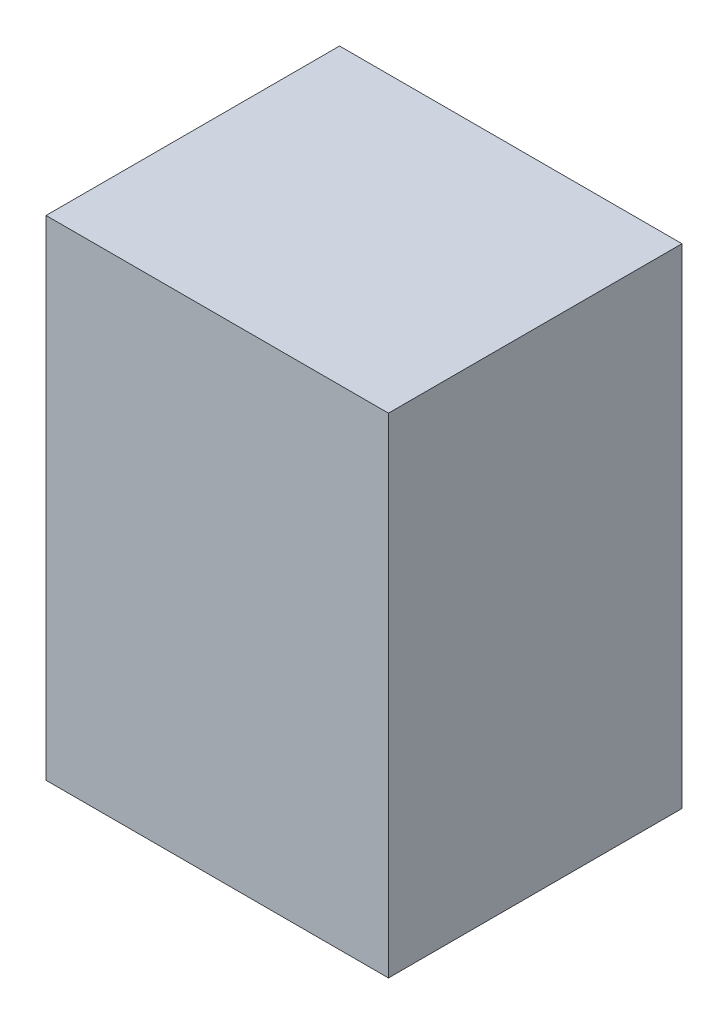
ISO-10303-21;
HEADER;
FILE_DESCRIPTION(('STEP AP214'),'2;1');
FILE_NAME('part.step','',(''),(''),'','','');
FILE_SCHEMA(('AUTOMOTIVE_DESIGN { 1 0 10303 214 1 1 1 1 }'));
ENDSEC;
DATA;
#1=APPLICATION_CONTEXT('core data for automotive mechanical design processes');
#2=APPLICATION_PROTOCOL_DEFINITION('international standard','automotive_design',2000,#1);
#3=PRODUCT_CONTEXT('',#1,'mechanical');
#4=PRODUCT('Part','Part','',(#3));
#5=PRODUCT_RELATED_PRODUCT_CATEGORY('part','',(#4));
#6=PRODUCT_DEFINITION_FORMATION('','',#4);
#7=PRODUCT_DEFINITION_CONTEXT('part definition',#1,'design');
#8=PRODUCT_DEFINITION('design','',#6,#7);
#9=PRODUCT_DEFINITION_SHAPE('','',#8);
#10=(LENGTH_UNIT() NAMED_UNIT(*) SI_UNIT(.MILLI.,.METRE.));
#11=(NAMED_UNIT(*) PLANE_ANGLE_UNIT() SI_UNIT($,.RADIAN.));
#12=(NAMED_UNIT(*) SI_UNIT($,.STERADIAN.) SOLID_ANGLE_UNIT());
#13=UNCERTAINTY_MEASURE_WITH_UNIT(LENGTH_MEASURE(1.E-05),#10,'distance_accuracy_value','');
#14=(GEOMETRIC_REPRESENTATION_CONTEXT(3) GLOBAL_UNCERTAINTY_ASSIGNED_CONTEXT((#13)) GLOBAL_UNIT_ASSIGNED_CONTEXT((#10,
#11,#12)) REPRESENTATION_CONTEXT('',''));
#15=CARTESIAN_POINT('',(0.,0.,0.));
#16=DIRECTION('',(0.,0.,1.));
#17=DIRECTION('',(1.,0.,0.));
#18=AXIS2_PLACEMENT_3D('',#15,#16,#17);
#19=CARTESIAN_POINT('',(17.5,25.,30.));
#20=DIRECTION('',(-1.,0.,0.));
#21=DIRECTION('',(0.,-1.,0.));
#22=AXIS2_PLACEMENT_3D('',#19,#20,#21);
#23=PLANE('',#22);
#24=DIRECTION('',(0.,1.,0.));
#25=VECTOR('',#24,1.);
#26=CARTESIAN_POINT('',(17.5,25.,0.));
#27=LINE('',#26,#25);
#28=CARTESIAN_POINT('',(17.5,-25.,0.));
#29=VERTEX_POINT('',#28);
#30=CARTESIAN_POINT('',(17.5,25.,0.));
#31=VERTEX_POINT('',#30);
#32=EDGE_CURVE('E107',#29,#31,#27,.T.);
#33=ORIENTED_EDGE('',*,*,#32,.T.);
#34=DIRECTION('',(0.,0.,-1.));
#35=VECTOR('',#34,1.);
#36=CARTESIAN_POINT('',(17.5,25.,30.));
#37=LINE('',#36,#35);
#38=CARTESIAN_POINT('',(17.5,25.,30.));
#39=VERTEX_POINT('',#38);
#40=EDGE_CURVE('E11',#39,#31,#37,.T.);
#41=ORIENTED_EDGE('',*,*,#40,.F.);
#42=DIRECTION('',(0.,1.,0.));
#43=VECTOR('',#42,1.);
#44=CARTESIAN_POINT('',(17.5,25.,30.));
#45=LINE('',#44,#43);
#46=CARTESIAN_POINT('',(17.5,-25.,30.));
#47=VERTEX_POINT('',#46);
#48=EDGE_CURVE('E91',#47,#39,#45,.T.);
#49=ORIENTED_EDGE('',*,*,#48,.F.);
#50=DIRECTION('',(0.,0.,-1.));
#51=VECTOR('',#50,1.);
#52=CARTESIAN_POINT('',(17.5,-25.,30.));
#53=LINE('',#52,#51);
#54=EDGE_CURVE('E103',#47,#29,#53,.T.);
#55=ORIENTED_EDGE('',*,*,#54,.T.);
#56=EDGE_LOOP('',(#33,#41,#49,#55));
#57=FACE_BOUND('',#56,.T.);
#58=ADVANCED_FACE('F39',(#57),#23,.F.);
#59=CARTESIAN_POINT('',(-17.5,25.,30.));
#60=DIRECTION('',(0.,-1.,0.));
#61=DIRECTION('',(0.,0.,-1.));
#62=AXIS2_PLACEMENT_3D('',#59,#60,#61);
#63=PLANE('',#62);
#64=DIRECTION('',(-1.,0.,0.));
#65=VECTOR('',#64,1.);
#66=CARTESIAN_POINT('',(-17.5,25.,0.));
#67=LINE('',#66,#65);
#68=CARTESIAN_POINT('',(-17.5,25.,0.));
#69=VERTEX_POINT('',#68);
#70=EDGE_CURVE('E96',#31,#69,#67,.T.);
#71=ORIENTED_EDGE('',*,*,#70,.T.);
#72=DIRECTION('',(0.,0.,-1.));
#73=VECTOR('',#72,1.);
#74=CARTESIAN_POINT('',(-17.5,25.,30.));
#75=LINE('',#74,#73);
#76=CARTESIAN_POINT('',(-17.5,25.,30.));
#77=VERTEX_POINT('',#76);
#78=EDGE_CURVE('E48',#77,#69,#75,.T.);
#79=ORIENTED_EDGE('',*,*,#78,.F.);
#80=DIRECTION('',(-1.,0.,0.));
#81=VECTOR('',#80,1.);
#82=CARTESIAN_POINT('',(-17.5,25.,30.));
#83=LINE('',#82,#81);
#84=EDGE_CURVE('E86',#39,#77,#83,.T.);
#85=ORIENTED_EDGE('',*,*,#84,.F.);
#86=ORIENTED_EDGE('',*,*,#40,.T.);
#87=EDGE_LOOP('',(#71,#79,#85,#86));
#88=FACE_BOUND('',#87,.T.);
#89=ADVANCED_FACE('F95',(#88),#63,.F.);
#90=CARTESIAN_POINT('',(-17.5,25.,30.));
#91=DIRECTION('',(1.,0.,0.));
#92=DIRECTION('',(0.,1.,0.));
#93=AXIS2_PLACEMENT_3D('',#90,#91,#92);
#94=PLANE('',#93);
#95=DIRECTION('',(0.,-1.,0.));
#96=VECTOR('',#95,1.);
#97=CARTESIAN_POINT('',(-17.5,25.,0.));
#98=LINE('',#97,#96);
#99=CARTESIAN_POINT('',(-17.5,-25.,0.));
#100=VERTEX_POINT('',#99);
#101=EDGE_CURVE('E73',#69,#100,#98,.T.);
#102=ORIENTED_EDGE('',*,*,#101,.T.);
#103=DIRECTION('',(0.,0.,-1.));
#104=VECTOR('',#103,1.);
#105=CARTESIAN_POINT('',(-17.5,-25.,30.));
#106=LINE('',#105,#104);
#107=CARTESIAN_POINT('',(-17.5,-25.,30.));
#108=VERTEX_POINT('',#107);
#109=EDGE_CURVE('E98',#108,#100,#106,.T.);
#110=ORIENTED_EDGE('',*,*,#109,.F.);
#111=DIRECTION('',(0.,-1.,0.));
#112=VECTOR('',#111,1.);
#113=CARTESIAN_POINT('',(-17.5,25.,30.));
#114=LINE('',#113,#112);
#115=EDGE_CURVE('E89',#77,#108,#114,.T.);
#116=ORIENTED_EDGE('',*,*,#115,.F.);
#117=ORIENTED_EDGE('',*,*,#78,.T.);
#118=EDGE_LOOP('',(#102,#110,#116,#117));
#119=FACE_BOUND('',#118,.T.);
#120=ADVANCED_FACE('F99',(#119),#94,.F.);
#121=CARTESIAN_POINT('',(-17.5,-25.,30.));
#122=DIRECTION('',(0.,1.,0.));
#123=DIRECTION('',(0.,0.,1.));
#124=AXIS2_PLACEMENT_3D('',#121,#122,#123);
#125=PLANE('',#124);
#126=DIRECTION('',(1.,0.,0.));
#127=VECTOR('',#126,1.);
#128=CARTESIAN_POINT('',(-17.5,-25.,0.));
#129=LINE('',#128,#127);
#130=EDGE_CURVE('E79',#100,#29,#129,.T.);
#131=ORIENTED_EDGE('',*,*,#130,.T.);
#132=ORIENTED_EDGE('',*,*,#54,.F.);
#133=DIRECTION('',(1.,0.,0.));
#134=VECTOR('',#133,1.);
#135=CARTESIAN_POINT('',(-17.5,-25.,30.));
#136=LINE('',#135,#134);
#137=EDGE_CURVE('E56',#108,#47,#136,.T.);
#138=ORIENTED_EDGE('',*,*,#137,.F.);
#139=ORIENTED_EDGE('',*,*,#109,.T.);
#140=EDGE_LOOP('',(#131,#132,#138,#139));
#141=FACE_BOUND('',#140,.T.);
#142=ADVANCED_FACE('F120',(#141),#125,.F.);
#143=CARTESIAN_POINT('',(0.,0.,30.));
#144=DIRECTION('',(0.,0.,1.));
#145=DIRECTION('',(1.,0.,0.));
#146=AXIS2_PLACEMENT_3D('',#143,#144,#145);
#147=PLANE('',#146);
#148=ORIENTED_EDGE('',*,*,#48,.T.);
#149=ORIENTED_EDGE('',*,*,#84,.T.);
#150=ORIENTED_EDGE('',*,*,#115,.T.);
#151=ORIENTED_EDGE('',*,*,#137,.T.);
#152=EDGE_LOOP('',(#148,#149,#150,#151));
#153=FACE_BOUND('',#152,.T.);
#154=ADVANCED_FACE('F87',(#153),#147,.T.);
#155=CARTESIAN_POINT('',(0.,0.,0.));
#156=DIRECTION('',(0.,0.,1.));
#157=DIRECTION('',(1.,0.,0.));
#158=AXIS2_PLACEMENT_3D('',#155,#156,#157);
#159=PLANE('',#158);
#160=ORIENTED_EDGE('',*,*,#32,.F.);
#161=ORIENTED_EDGE('',*,*,#130,.F.);
#162=ORIENTED_EDGE('',*,*,#101,.F.);
#163=ORIENTED_EDGE('',*,*,#70,.F.);
#164=EDGE_LOOP('',(#160,#161,#162,#163));
#165=FACE_BOUND('',#164,.T.);
#166=ADVANCED_FACE('F123',(#165),#159,.F.);
#167=CLOSED_SHELL('',(#58,#89,#120,#142,#154,#166));
#168=MANIFOLD_SOLID_BREP('B2',#167);
#169=ADVANCED_BREP_SHAPE_REPRESENTATION('',(#18,#168),#14);
#170=SHAPE_DEFINITION_REPRESENTATION(#9,#169);
ENDSEC;
END-ISO-10303-21;
